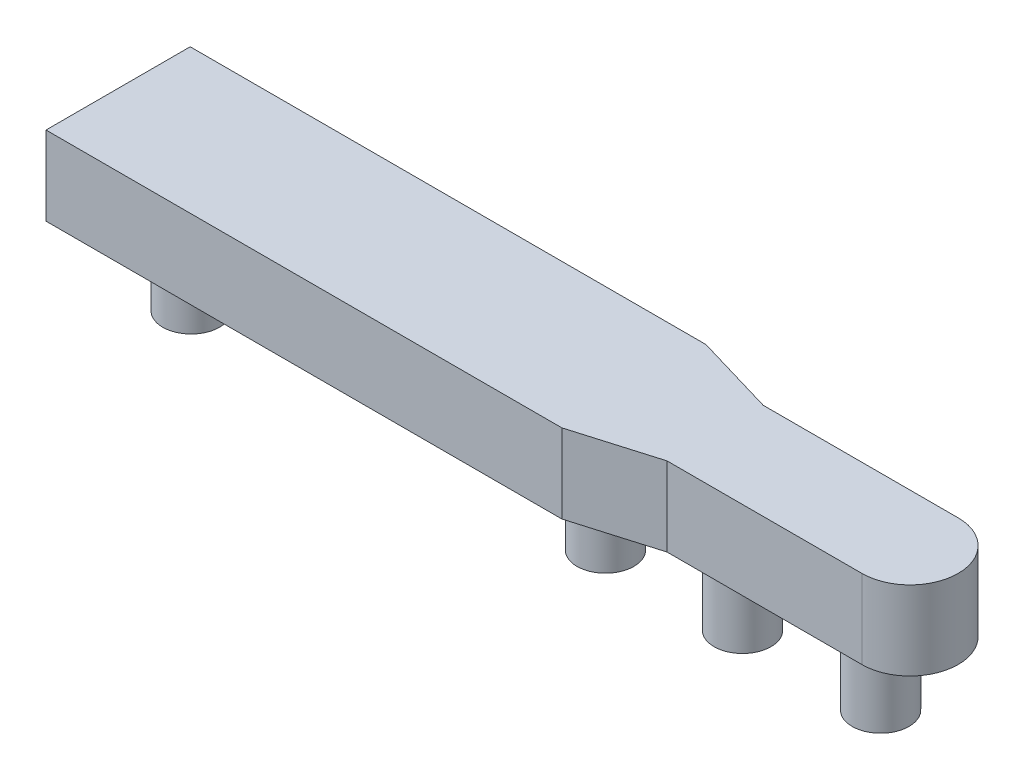
ISO-10303-21;
HEADER;
FILE_DESCRIPTION(('STEP AP214'),'2;1');
FILE_NAME('part.step','',(''),(''),'','','');
FILE_SCHEMA(('AUTOMOTIVE_DESIGN { 1 0 10303 214 1 1 1 1 }'));
ENDSEC;
DATA;
#1=APPLICATION_CONTEXT('core data for automotive mechanical design processes');
#2=APPLICATION_PROTOCOL_DEFINITION('international standard','automotive_design',2000,#1);
#3=PRODUCT_CONTEXT('',#1,'mechanical');
#4=PRODUCT('Part','Part','',(#3));
#5=PRODUCT_RELATED_PRODUCT_CATEGORY('part','',(#4));
#6=PRODUCT_DEFINITION_FORMATION('','',#4);
#7=PRODUCT_DEFINITION_CONTEXT('part definition',#1,'design');
#8=PRODUCT_DEFINITION('design','',#6,#7);
#9=PRODUCT_DEFINITION_SHAPE('','',#8);
#10=(LENGTH_UNIT() NAMED_UNIT(*) SI_UNIT(.MILLI.,.METRE.));
#11=(NAMED_UNIT(*) PLANE_ANGLE_UNIT() SI_UNIT($,.RADIAN.));
#12=(NAMED_UNIT(*) SI_UNIT($,.STERADIAN.) SOLID_ANGLE_UNIT());
#13=UNCERTAINTY_MEASURE_WITH_UNIT(LENGTH_MEASURE(1.E-05),#10,'distance_accuracy_value','');
#14=(GEOMETRIC_REPRESENTATION_CONTEXT(3) GLOBAL_UNCERTAINTY_ASSIGNED_CONTEXT((#13)) GLOBAL_UNIT_ASSIGNED_CONTEXT((#10,
#11,#12)) REPRESENTATION_CONTEXT('',''));
#15=CARTESIAN_POINT('',(0.,0.,0.));
#16=DIRECTION('',(0.,0.,1.));
#17=DIRECTION('',(1.,0.,0.));
#18=AXIS2_PLACEMENT_3D('',#15,#16,#17);
#19=CARTESIAN_POINT('',(-17.4690123816132,9.12107866527539,17.75));
#20=DIRECTION('',(1.,0.,0.));
#21=DIRECTION('',(0.,0.,-1.));
#22=AXIS2_PLACEMENT_3D('',#19,#20,#21);
#23=PLANE('',#22);
#24=DIRECTION('',(0.,-1.,0.));
#25=VECTOR('',#24,1.);
#26=CARTESIAN_POINT('',(-17.4690123816132,9.12107866527539,0.));
#27=LINE('',#26,#25);
#28=CARTESIAN_POINT('',(-17.4690123816132,9.12107866527539,0.));
#29=VERTEX_POINT('',#28);
#30=CARTESIAN_POINT('',(-17.4690123816132,-0.598921334724609,0.));
#31=VERTEX_POINT('',#30);
#32=EDGE_CURVE('E86',#29,#31,#27,.T.);
#33=ORIENTED_EDGE('',*,*,#32,.T.);
#34=DIRECTION('',(0.,0.,-1.));
#35=VECTOR('',#34,1.);
#36=CARTESIAN_POINT('',(-17.4690123816132,-0.598921334724609,17.75));
#37=LINE('',#36,#35);
#38=CARTESIAN_POINT('',(-17.4690123816132,-0.598921334724609,17.75));
#39=VERTEX_POINT('',#38);
#40=EDGE_CURVE('E87',#39,#31,#37,.T.);
#41=ORIENTED_EDGE('',*,*,#40,.F.);
#42=DIRECTION('',(0.,-1.,0.));
#43=VECTOR('',#42,1.);
#44=CARTESIAN_POINT('',(-17.4690123816132,9.12107866527539,17.75));
#45=LINE('',#44,#43);
#46=CARTESIAN_POINT('',(-17.4690123816132,9.12107866527539,17.75));
#47=VERTEX_POINT('',#46);
#48=EDGE_CURVE('E80',#47,#39,#45,.T.);
#49=ORIENTED_EDGE('',*,*,#48,.F.);
#50=DIRECTION('',(0.,0.,-1.));
#51=VECTOR('',#50,1.);
#52=CARTESIAN_POINT('',(-17.4690123816132,9.12107866527539,17.75));
#53=LINE('',#52,#51);
#54=EDGE_CURVE('E74',#47,#29,#53,.T.);
#55=ORIENTED_EDGE('',*,*,#54,.T.);
#56=EDGE_LOOP('',(#33,#41,#49,#55));
#57=FACE_BOUND('',#56,.T.);
#58=ADVANCED_FACE('F33',(#57),#23,.F.);
#59=CARTESIAN_POINT('',(-17.4690123816132,-0.598921334724609,17.75));
#60=DIRECTION('',(0.,1.,0.));
#61=DIRECTION('',(-1.,0.,0.));
#62=AXIS2_PLACEMENT_3D('',#59,#60,#61);
#63=PLANE('',#62);
#64=CARTESIAN_POINT('',(76.5308957065724,-0.59892133472461,9.));
#65=DIRECTION('',(0.,1.,0.));
#66=DIRECTION('',(-1.,0.,0.));
#67=AXIS2_PLACEMENT_3D('',#64,#65,#66);
#68=CIRCLE('',#67,3.50000000000001);
#69=CARTESIAN_POINT('',(73.0308957065724,-0.59892133472461,9.));
#70=VERTEX_POINT('',#69);
#71=EDGE_CURVE('E11',#70,#70,#68,.F.);
#72=ORIENTED_EDGE('',*,*,#71,.F.);
#73=EDGE_LOOP('',(#72));
#74=FACE_BOUND('',#73,.T.);
#75=CARTESIAN_POINT('',(59.5308727285839,-0.59892133472461,9.));
#76=DIRECTION('',(0.,1.,0.));
#77=DIRECTION('',(-1.,0.,0.));
#78=AXIS2_PLACEMENT_3D('',#75,#76,#77);
#79=CIRCLE('',#78,3.50000000000001);
#80=CARTESIAN_POINT('',(56.0308727285839,-0.59892133472461,9.));
#81=VERTEX_POINT('',#80);
#82=EDGE_CURVE('E40',#81,#81,#79,.F.);
#83=ORIENTED_EDGE('',*,*,#82,.F.);
#84=EDGE_LOOP('',(#83));
#85=FACE_BOUND('',#84,.T.);
#86=CARTESIAN_POINT('',(42.5309876183868,-0.59892133472461,8.87500000000002));
#87=DIRECTION('',(0.,1.,0.));
#88=DIRECTION('',(-1.,0.,0.));
#89=AXIS2_PLACEMENT_3D('',#86,#87,#88);
#90=CIRCLE('',#89,3.50000000000001);
#91=CARTESIAN_POINT('',(39.0309876183868,-0.59892133472461,8.87500000000002));
#92=VERTEX_POINT('',#91);
#93=EDGE_CURVE('E104',#92,#92,#90,.F.);
#94=ORIENTED_EDGE('',*,*,#93,.F.);
#95=EDGE_LOOP('',(#94));
#96=FACE_BOUND('',#95,.T.);
#97=CARTESIAN_POINT('',(-8.46901238161318,-0.59892133472461,8.875));
#98=DIRECTION('',(0.,1.,0.));
#99=DIRECTION('',(-1.,0.,0.));
#100=AXIS2_PLACEMENT_3D('',#97,#98,#99);
#101=CIRCLE('',#100,3.50000000000001);
#102=CARTESIAN_POINT('',(-11.9690123816132,-0.59892133472461,8.875));
#103=VERTEX_POINT('',#102);
#104=EDGE_CURVE('E101',#103,#103,#101,.F.);
#105=ORIENTED_EDGE('',*,*,#104,.F.);
#106=EDGE_LOOP('',(#105));
#107=FACE_BOUND('',#106,.T.);
#108=DIRECTION('',(1.,0.,0.));
#109=VECTOR('',#108,1.);
#110=CARTESIAN_POINT('',(-17.4690123816132,-0.598921334724609,0.));
#111=LINE('',#110,#109);
#112=CARTESIAN_POINT('',(46.0309876183868,-0.598921334724609,0.));
#113=VERTEX_POINT('',#112);
#114=EDGE_CURVE('E81',#31,#113,#111,.T.);
#115=ORIENTED_EDGE('',*,*,#114,.T.);
#116=DIRECTION('',(-0.959136092351471,0.,-0.282945147243684));
#117=VECTOR('',#116,1.);
#118=CARTESIAN_POINT('',(46.0309876183868,-0.59892133472461,0.));
#119=LINE('',#118,#117);
#120=CARTESIAN_POINT('',(56.0309876183868,-0.59892133472461,2.95));
#121=VERTEX_POINT('',#120);
#122=EDGE_CURVE('E47',#121,#113,#119,.T.);
#123=ORIENTED_EDGE('',*,*,#122,.F.);
#124=DIRECTION('',(-1.,0.,0.));
#125=VECTOR('',#124,1.);
#126=CARTESIAN_POINT('',(80.0309876183868,-0.59892133472461,2.95000000000001));
#127=LINE('',#126,#125);
#128=CARTESIAN_POINT('',(80.0309876183868,-0.59892133472461,2.95000000000001));
#129=VERTEX_POINT('',#128);
#130=EDGE_CURVE('E146',#129,#121,#127,.T.);
#131=ORIENTED_EDGE('',*,*,#130,.F.);
#132=CARTESIAN_POINT('',(80.0309876183868,-0.59892133472461,8.875));
#133=DIRECTION('',(0.,1.,0.));
#134=DIRECTION('',(1.,0.,0.));
#135=AXIS2_PLACEMENT_3D('',#132,#133,#134);
#136=CIRCLE('',#135,5.92499999999999);
#137=CARTESIAN_POINT('',(80.0309876183868,-0.59892133472461,14.8));
#138=VERTEX_POINT('',#137);
#139=EDGE_CURVE('E149',#138,#129,#136,.T.);
#140=ORIENTED_EDGE('',*,*,#139,.F.);
#141=DIRECTION('',(1.,0.,0.));
#142=VECTOR('',#141,1.);
#143=CARTESIAN_POINT('',(56.0309876183868,-0.59892133472461,14.8));
#144=LINE('',#143,#142);
#145=CARTESIAN_POINT('',(56.0309876183868,-0.59892133472461,14.8));
#146=VERTEX_POINT('',#145);
#147=EDGE_CURVE('E152',#146,#138,#144,.T.);
#148=ORIENTED_EDGE('',*,*,#147,.F.);
#149=DIRECTION('',(0.959136092351471,0.,-0.282945147243684));
#150=VECTOR('',#149,1.);
#151=CARTESIAN_POINT('',(46.0309876183868,-0.59892133472461,17.75));
#152=LINE('',#151,#150);
#153=CARTESIAN_POINT('',(46.0309876183868,-0.59892133472461,17.75));
#154=VERTEX_POINT('',#153);
#155=EDGE_CURVE('E127',#154,#146,#152,.T.);
#156=ORIENTED_EDGE('',*,*,#155,.F.);
#157=DIRECTION('',(1.,0.,0.));
#158=VECTOR('',#157,1.);
#159=CARTESIAN_POINT('',(-17.4690123816132,-0.598921334724609,17.75));
#160=LINE('',#159,#158);
#161=EDGE_CURVE('E123',#39,#154,#160,.T.);
#162=ORIENTED_EDGE('',*,*,#161,.F.);
#163=ORIENTED_EDGE('',*,*,#40,.T.);
#164=EDGE_LOOP('',(#115,#123,#131,#140,#148,#156,#162,#163));
#165=FACE_BOUND('',#164,.T.);
#166=ADVANCED_FACE('F111',(#74,#85,#96,#107,#165),#63,.F.);
#167=CARTESIAN_POINT('',(-17.4690123816132,9.12107866527539,17.75));
#168=DIRECTION('',(0.,-1.,0.));
#169=DIRECTION('',(0.,0.,-1.));
#170=AXIS2_PLACEMENT_3D('',#167,#168,#169);
#171=PLANE('',#170);
#172=DIRECTION('',(-1.,0.,0.));
#173=VECTOR('',#172,1.);
#174=CARTESIAN_POINT('',(80.0309876183868,9.12107866527539,2.95000000000001));
#175=LINE('',#174,#173);
#176=CARTESIAN_POINT('',(80.0309876183868,9.12107866527539,2.95000000000001));
#177=VERTEX_POINT('',#176);
#178=CARTESIAN_POINT('',(56.0309876183868,9.12107866527539,2.95));
#179=VERTEX_POINT('',#178);
#180=EDGE_CURVE('E158',#177,#179,#175,.T.);
#181=ORIENTED_EDGE('',*,*,#180,.T.);
#182=DIRECTION('',(-0.959136092351471,0.,-0.282945147243684));
#183=VECTOR('',#182,1.);
#184=CARTESIAN_POINT('',(46.0309876183868,9.12107866527539,0.));
#185=LINE('',#184,#183);
#186=CARTESIAN_POINT('',(46.0309876183868,9.12107866527539,0.));
#187=VERTEX_POINT('',#186);
#188=EDGE_CURVE('E77',#179,#187,#185,.T.);
#189=ORIENTED_EDGE('',*,*,#188,.T.);
#190=DIRECTION('',(-1.,0.,0.));
#191=VECTOR('',#190,1.);
#192=CARTESIAN_POINT('',(-17.4690123816132,9.12107866527539,0.));
#193=LINE('',#192,#191);
#194=EDGE_CURVE('E70',#187,#29,#193,.T.);
#195=ORIENTED_EDGE('',*,*,#194,.T.);
#196=ORIENTED_EDGE('',*,*,#54,.F.);
#197=DIRECTION('',(-1.,0.,0.));
#198=VECTOR('',#197,1.);
#199=CARTESIAN_POINT('',(-17.4690123816132,9.12107866527539,17.75));
#200=LINE('',#199,#198);
#201=CARTESIAN_POINT('',(46.0309876183868,9.12107866527539,17.75));
#202=VERTEX_POINT('',#201);
#203=EDGE_CURVE('E56',#202,#47,#200,.T.);
#204=ORIENTED_EDGE('',*,*,#203,.F.);
#205=DIRECTION('',(0.959136092351471,0.,-0.282945147243684));
#206=VECTOR('',#205,1.);
#207=CARTESIAN_POINT('',(46.0309876183868,9.12107866527539,17.75));
#208=LINE('',#207,#206);
#209=CARTESIAN_POINT('',(56.0309876183868,9.12107866527539,14.8));
#210=VERTEX_POINT('',#209);
#211=EDGE_CURVE('E145',#202,#210,#208,.T.);
#212=ORIENTED_EDGE('',*,*,#211,.T.);
#213=DIRECTION('',(1.,0.,0.));
#214=VECTOR('',#213,1.);
#215=CARTESIAN_POINT('',(56.0309876183868,9.12107866527539,14.8));
#216=LINE('',#215,#214);
#217=CARTESIAN_POINT('',(80.0309876183868,9.12107866527539,14.8));
#218=VERTEX_POINT('',#217);
#219=EDGE_CURVE('E163',#210,#218,#216,.T.);
#220=ORIENTED_EDGE('',*,*,#219,.T.);
#221=CARTESIAN_POINT('',(80.0309876183868,9.12107866527539,8.875));
#222=DIRECTION('',(0.,1.,0.));
#223=DIRECTION('',(1.,0.,0.));
#224=AXIS2_PLACEMENT_3D('',#221,#222,#223);
#225=CIRCLE('',#224,5.92499999999999);
#226=EDGE_CURVE('E160',#218,#177,#225,.T.);
#227=ORIENTED_EDGE('',*,*,#226,.T.);
#228=EDGE_LOOP('',(#181,#189,#195,#196,#204,#212,#220,#227));
#229=FACE_BOUND('',#228,.T.);
#230=ADVANCED_FACE('F73',(#229),#171,.F.);
#231=CARTESIAN_POINT('',(0.,0.,17.75));
#232=DIRECTION('',(0.,0.,1.));
#233=DIRECTION('',(1.,0.,0.));
#234=AXIS2_PLACEMENT_3D('',#231,#232,#233);
#235=PLANE('',#234);
#236=DIRECTION('',(0.,-1.,0.));
#237=VECTOR('',#236,1.);
#238=CARTESIAN_POINT('',(46.0309876183868,9.12107866527539,17.75));
#239=LINE('',#238,#237);
#240=EDGE_CURVE('E131',#202,#154,#239,.T.);
#241=ORIENTED_EDGE('',*,*,#240,.F.);
#242=ORIENTED_EDGE('',*,*,#203,.T.);
#243=ORIENTED_EDGE('',*,*,#48,.T.);
#244=ORIENTED_EDGE('',*,*,#161,.T.);
#245=EDGE_LOOP('',(#241,#242,#243,#244));
#246=FACE_BOUND('',#245,.T.);
#247=ADVANCED_FACE('F128',(#246),#235,.T.);
#248=CARTESIAN_POINT('',(0.,0.,0.));
#249=DIRECTION('',(0.,0.,1.));
#250=DIRECTION('',(1.,0.,0.));
#251=AXIS2_PLACEMENT_3D('',#248,#249,#250);
#252=PLANE('',#251);
#253=ORIENTED_EDGE('',*,*,#194,.F.);
#254=DIRECTION('',(0.,-1.,0.));
#255=VECTOR('',#254,1.);
#256=CARTESIAN_POINT('',(46.0309876183868,9.12107866527539,0.));
#257=LINE('',#256,#255);
#258=EDGE_CURVE('E92',#187,#113,#257,.T.);
#259=ORIENTED_EDGE('',*,*,#258,.T.);
#260=ORIENTED_EDGE('',*,*,#114,.F.);
#261=ORIENTED_EDGE('',*,*,#32,.F.);
#262=EDGE_LOOP('',(#253,#259,#260,#261));
#263=FACE_BOUND('',#262,.T.);
#264=ADVANCED_FACE('F89',(#263),#252,.F.);
#265=CARTESIAN_POINT('',(46.0309876183868,9.12107866527539,0.));
#266=DIRECTION('',(-0.282945147243684,0.,0.959136092351471));
#267=DIRECTION('',(0.959136092351471,0.,0.282945147243684));
#268=AXIS2_PLACEMENT_3D('',#265,#266,#267);
#269=PLANE('',#268);
#270=ORIENTED_EDGE('',*,*,#122,.T.);
#271=ORIENTED_EDGE('',*,*,#258,.F.);
#272=ORIENTED_EDGE('',*,*,#188,.F.);
#273=DIRECTION('',(0.,-1.,0.));
#274=VECTOR('',#273,1.);
#275=CARTESIAN_POINT('',(56.0309876183868,9.12107866527539,2.95));
#276=LINE('',#275,#274);
#277=EDGE_CURVE('E95',#179,#121,#276,.T.);
#278=ORIENTED_EDGE('',*,*,#277,.T.);
#279=EDGE_LOOP('',(#270,#271,#272,#278));
#280=FACE_BOUND('',#279,.T.);
#281=ADVANCED_FACE('F222',(#280),#269,.F.);
#282=CARTESIAN_POINT('',(80.0309876183868,9.12107866527539,2.95000000000001));
#283=DIRECTION('',(0.,0.,1.));
#284=DIRECTION('',(1.,0.,0.));
#285=AXIS2_PLACEMENT_3D('',#282,#283,#284);
#286=PLANE('',#285);
#287=ORIENTED_EDGE('',*,*,#130,.T.);
#288=ORIENTED_EDGE('',*,*,#277,.F.);
#289=ORIENTED_EDGE('',*,*,#180,.F.);
#290=DIRECTION('',(0.,-1.,0.));
#291=VECTOR('',#290,1.);
#292=CARTESIAN_POINT('',(80.0309876183868,9.12107866527539,2.95000000000001));
#293=LINE('',#292,#291);
#294=EDGE_CURVE('E140',#177,#129,#293,.T.);
#295=ORIENTED_EDGE('',*,*,#294,.T.);
#296=EDGE_LOOP('',(#287,#288,#289,#295));
#297=FACE_BOUND('',#296,.T.);
#298=ADVANCED_FACE('F229',(#297),#286,.F.);
#299=CARTESIAN_POINT('',(80.0309876183868,9.12107866527539,8.875));
#300=DIRECTION('',(0.,-1.,0.));
#301=DIRECTION('',(1.,0.,0.));
#302=AXIS2_PLACEMENT_3D('',#299,#300,#301);
#303=CYLINDRICAL_SURFACE('',#302,5.92499999999999);
#304=ORIENTED_EDGE('',*,*,#139,.T.);
#305=ORIENTED_EDGE('',*,*,#294,.F.);
#306=ORIENTED_EDGE('',*,*,#226,.F.);
#307=DIRECTION('',(0.,-1.,0.));
#308=VECTOR('',#307,1.);
#309=CARTESIAN_POINT('',(80.0309876183868,9.12107866527539,14.8));
#310=LINE('',#309,#308);
#311=EDGE_CURVE('E137',#218,#138,#310,.T.);
#312=ORIENTED_EDGE('',*,*,#311,.T.);
#313=EDGE_LOOP('',(#304,#305,#306,#312));
#314=FACE_BOUND('',#313,.T.);
#315=ADVANCED_FACE('F236',(#314),#303,.T.);
#316=CARTESIAN_POINT('',(56.0309876183868,9.12107866527539,14.8));
#317=DIRECTION('',(0.,0.,-1.));
#318=DIRECTION('',(-1.,0.,0.));
#319=AXIS2_PLACEMENT_3D('',#316,#317,#318);
#320=PLANE('',#319);
#321=ORIENTED_EDGE('',*,*,#147,.T.);
#322=ORIENTED_EDGE('',*,*,#311,.F.);
#323=ORIENTED_EDGE('',*,*,#219,.F.);
#324=DIRECTION('',(0.,-1.,0.));
#325=VECTOR('',#324,1.);
#326=CARTESIAN_POINT('',(56.0309876183868,9.12107866527539,14.8));
#327=LINE('',#326,#325);
#328=EDGE_CURVE('E134',#210,#146,#327,.T.);
#329=ORIENTED_EDGE('',*,*,#328,.T.);
#330=EDGE_LOOP('',(#321,#322,#323,#329));
#331=FACE_BOUND('',#330,.T.);
#332=ADVANCED_FACE('F244',(#331),#320,.F.);
#333=CARTESIAN_POINT('',(46.0309876183868,9.12107866527539,17.75));
#334=DIRECTION('',(-0.282945147243684,0.,-0.959136092351471));
#335=DIRECTION('',(-0.959136092351471,0.,0.282945147243684));
#336=AXIS2_PLACEMENT_3D('',#333,#334,#335);
#337=PLANE('',#336);
#338=ORIENTED_EDGE('',*,*,#155,.T.);
#339=ORIENTED_EDGE('',*,*,#328,.F.);
#340=ORIENTED_EDGE('',*,*,#211,.F.);
#341=ORIENTED_EDGE('',*,*,#240,.T.);
#342=EDGE_LOOP('',(#338,#339,#340,#341));
#343=FACE_BOUND('',#342,.T.);
#344=ADVANCED_FACE('F252',(#343),#337,.F.);
#345=CARTESIAN_POINT('',(-8.46901238161318,-10.0989213347246,8.875));
#346=DIRECTION('',(0.,1.,0.));
#347=DIRECTION('',(-1.,0.,0.));
#348=AXIS2_PLACEMENT_3D('',#345,#346,#347);
#349=CYLINDRICAL_SURFACE('',#348,3.50000000000001);
#350=CARTESIAN_POINT('',(-8.46901238161318,-10.0989213347246,8.875));
#351=DIRECTION('',(0.,-1.,0.));
#352=DIRECTION('',(1.,0.,0.));
#353=AXIS2_PLACEMENT_3D('',#350,#351,#352);
#354=CIRCLE('',#353,3.50000000000001);
#355=CARTESIAN_POINT('',(-4.96901238161318,-10.0989213347246,8.875));
#356=VERTEX_POINT('',#355);
#357=EDGE_CURVE('E156',#356,#356,#354,.T.);
#358=ORIENTED_EDGE('',*,*,#357,.F.);
#359=EDGE_LOOP('',(#358));
#360=FACE_BOUND('',#359,.T.);
#361=ORIENTED_EDGE('',*,*,#104,.T.);
#362=EDGE_LOOP('',(#361));
#363=FACE_BOUND('',#362,.T.);
#364=ADVANCED_FACE('F259',(#360,#363),#349,.T.);
#365=CARTESIAN_POINT('',(-8.46901238161318,-10.0989213347246,8.875));
#366=DIRECTION('',(0.,-1.,0.));
#367=DIRECTION('',(1.,0.,0.));
#368=AXIS2_PLACEMENT_3D('',#365,#366,#367);
#369=PLANE('',#368);
#370=ORIENTED_EDGE('',*,*,#357,.T.);
#371=EDGE_LOOP('',(#370));
#372=FACE_BOUND('',#371,.T.);
#373=ADVANCED_FACE('F266',(#372),#369,.T.);
#374=CARTESIAN_POINT('',(42.5309876183868,-10.0989213347246,8.87500000000002));
#375=DIRECTION('',(0.,1.,0.));
#376=DIRECTION('',(-1.,0.,0.));
#377=AXIS2_PLACEMENT_3D('',#374,#375,#376);
#378=CYLINDRICAL_SURFACE('',#377,3.50000000000001);
#379=CARTESIAN_POINT('',(42.5309876183868,-10.0989213347246,8.87500000000002));
#380=DIRECTION('',(0.,-1.,0.));
#381=DIRECTION('',(1.,0.,0.));
#382=AXIS2_PLACEMENT_3D('',#379,#380,#381);
#383=CIRCLE('',#382,3.50000000000001);
#384=CARTESIAN_POINT('',(46.0309876183868,-10.0989213347246,8.87500000000002));
#385=VERTEX_POINT('',#384);
#386=EDGE_CURVE('E170',#385,#385,#383,.T.);
#387=ORIENTED_EDGE('',*,*,#386,.F.);
#388=EDGE_LOOP('',(#387));
#389=FACE_BOUND('',#388,.T.);
#390=ORIENTED_EDGE('',*,*,#93,.T.);
#391=EDGE_LOOP('',(#390));
#392=FACE_BOUND('',#391,.T.);
#393=ADVANCED_FACE('F274',(#389,#392),#378,.T.);
#394=CARTESIAN_POINT('',(42.5309876183868,-10.0989213347246,8.87500000000002));
#395=DIRECTION('',(0.,-1.,0.));
#396=DIRECTION('',(1.,0.,0.));
#397=AXIS2_PLACEMENT_3D('',#394,#395,#396);
#398=PLANE('',#397);
#399=ORIENTED_EDGE('',*,*,#386,.T.);
#400=EDGE_LOOP('',(#399));
#401=FACE_BOUND('',#400,.T.);
#402=ADVANCED_FACE('F282',(#401),#398,.T.);
#403=CARTESIAN_POINT('',(59.5308727285839,-10.0989213347246,9.));
#404=DIRECTION('',(0.,1.,0.));
#405=DIRECTION('',(-1.,0.,0.));
#406=AXIS2_PLACEMENT_3D('',#403,#404,#405);
#407=CYLINDRICAL_SURFACE('',#406,3.50000000000001);
#408=CARTESIAN_POINT('',(59.5308727285839,-10.0989213347246,9.));
#409=DIRECTION('',(0.,-1.,0.));
#410=DIRECTION('',(1.,0.,0.));
#411=AXIS2_PLACEMENT_3D('',#408,#409,#410);
#412=CIRCLE('',#411,3.50000000000001);
#413=CARTESIAN_POINT('',(63.0308727285839,-10.0989213347246,9.));
#414=VERTEX_POINT('',#413);
#415=EDGE_CURVE('E173',#414,#414,#412,.T.);
#416=ORIENTED_EDGE('',*,*,#415,.F.);
#417=EDGE_LOOP('',(#416));
#418=FACE_BOUND('',#417,.T.);
#419=ORIENTED_EDGE('',*,*,#82,.T.);
#420=EDGE_LOOP('',(#419));
#421=FACE_BOUND('',#420,.T.);
#422=ADVANCED_FACE('F109',(#418,#421),#407,.T.);
#423=CARTESIAN_POINT('',(59.5308727285839,-10.0989213347246,9.));
#424=DIRECTION('',(0.,-1.,0.));
#425=DIRECTION('',(1.,0.,0.));
#426=AXIS2_PLACEMENT_3D('',#423,#424,#425);
#427=PLANE('',#426);
#428=ORIENTED_EDGE('',*,*,#415,.T.);
#429=EDGE_LOOP('',(#428));
#430=FACE_BOUND('',#429,.T.);
#431=ADVANCED_FACE('F185',(#430),#427,.T.);
#432=CARTESIAN_POINT('',(76.5308957065724,-10.0989213347246,9.));
#433=DIRECTION('',(0.,1.,0.));
#434=DIRECTION('',(-1.,0.,0.));
#435=AXIS2_PLACEMENT_3D('',#432,#433,#434);
#436=CYLINDRICAL_SURFACE('',#435,3.50000000000001);
#437=CARTESIAN_POINT('',(76.5308957065724,-10.0989213347246,9.));
#438=DIRECTION('',(0.,-1.,0.));
#439=DIRECTION('',(1.,0.,0.));
#440=AXIS2_PLACEMENT_3D('',#437,#438,#439);
#441=CIRCLE('',#440,3.50000000000001);
#442=CARTESIAN_POINT('',(80.0308957065724,-10.0989213347246,9.));
#443=VERTEX_POINT('',#442);
#444=EDGE_CURVE('E176',#443,#443,#441,.T.);
#445=ORIENTED_EDGE('',*,*,#444,.F.);
#446=EDGE_LOOP('',(#445));
#447=FACE_BOUND('',#446,.T.);
#448=ORIENTED_EDGE('',*,*,#71,.T.);
#449=EDGE_LOOP('',(#448));
#450=FACE_BOUND('',#449,.T.);
#451=ADVANCED_FACE('F182',(#447,#450),#436,.T.);
#452=CARTESIAN_POINT('',(76.5308957065724,-10.0989213347246,9.));
#453=DIRECTION('',(0.,-1.,0.));
#454=DIRECTION('',(1.,0.,0.));
#455=AXIS2_PLACEMENT_3D('',#452,#453,#454);
#456=PLANE('',#455);
#457=ORIENTED_EDGE('',*,*,#444,.T.);
#458=EDGE_LOOP('',(#457));
#459=FACE_BOUND('',#458,.T.);
#460=ADVANCED_FACE('F180',(#459),#456,.T.);
#461=CLOSED_SHELL('',(#58,#166,#230,#247,#264,#281,#298,#315,#332,#344,#364,#373,#393,#402,#422,
#431,#451,#460));
#462=MANIFOLD_SOLID_BREP('B2',#461);
#463=ADVANCED_BREP_SHAPE_REPRESENTATION('',(#18,#462),#14);
#464=SHAPE_DEFINITION_REPRESENTATION(#9,#463);
ENDSEC;
END-ISO-10303-21;
